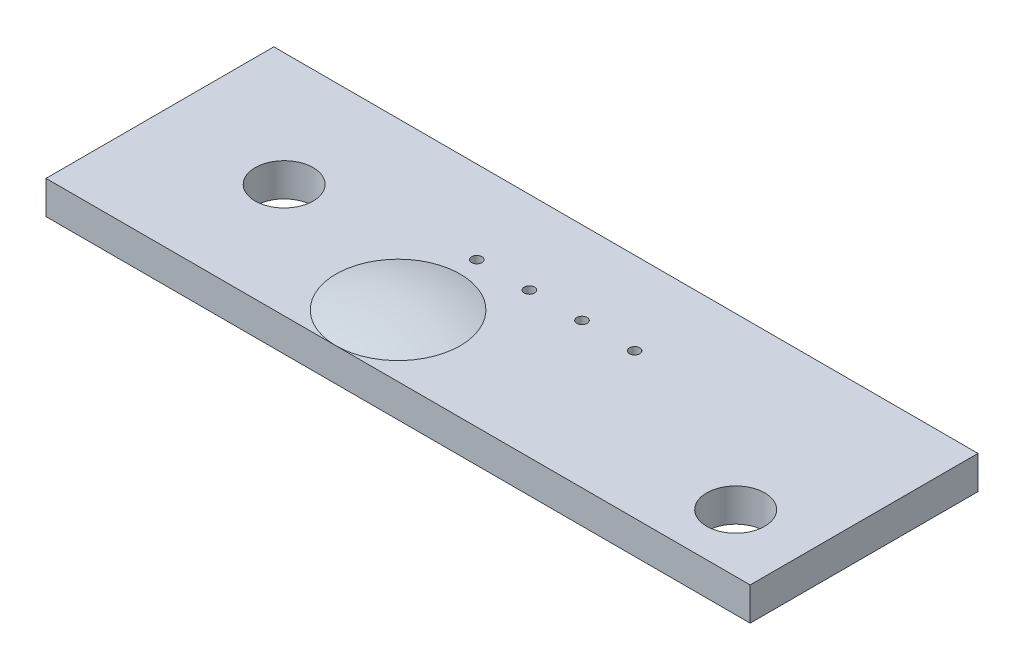
ISO-10303-21;
HEADER;
FILE_DESCRIPTION(('STEP AP214'),'2;1');
FILE_NAME('part.step','',(''),(''),'','','');
FILE_SCHEMA(('AUTOMOTIVE_DESIGN { 1 0 10303 214 1 1 1 1 }'));
ENDSEC;
DATA;
#1=APPLICATION_CONTEXT('core data for automotive mechanical design processes');
#2=APPLICATION_PROTOCOL_DEFINITION('international standard','automotive_design',2000,#1);
#3=PRODUCT_CONTEXT('',#1,'mechanical');
#4=PRODUCT('Part','Part','',(#3));
#5=PRODUCT_RELATED_PRODUCT_CATEGORY('part','',(#4));
#6=PRODUCT_DEFINITION_FORMATION('','',#4);
#7=PRODUCT_DEFINITION_CONTEXT('part definition',#1,'design');
#8=PRODUCT_DEFINITION('design','',#6,#7);
#9=PRODUCT_DEFINITION_SHAPE('','',#8);
#10=(LENGTH_UNIT() NAMED_UNIT(*) SI_UNIT(.MILLI.,.METRE.));
#11=(NAMED_UNIT(*) PLANE_ANGLE_UNIT() SI_UNIT($,.RADIAN.));
#12=(NAMED_UNIT(*) SI_UNIT($,.STERADIAN.) SOLID_ANGLE_UNIT());
#13=UNCERTAINTY_MEASURE_WITH_UNIT(LENGTH_MEASURE(1.E-05),#10,'distance_accuracy_value','');
#14=(GEOMETRIC_REPRESENTATION_CONTEXT(3) GLOBAL_UNCERTAINTY_ASSIGNED_CONTEXT((#13)) GLOBAL_UNIT_ASSIGNED_CONTEXT((#10,
#11,#12)) REPRESENTATION_CONTEXT('',''));
#15=CARTESIAN_POINT('',(0.,0.,0.));
#16=DIRECTION('',(0.,0.,1.));
#17=DIRECTION('',(1.,0.,0.));
#18=AXIS2_PLACEMENT_3D('',#15,#16,#17);
#19=CARTESIAN_POINT('',(-17.,1.6,-5.5));
#20=DIRECTION('',(0.,1.,0.));
#21=DIRECTION('',(0.,0.,1.));
#22=AXIS2_PLACEMENT_3D('',#19,#20,#21);
#23=PLANE('',#22);
#24=CARTESIAN_POINT('',(4.42,1.6,-1.50000000000006));
#25=DIRECTION('',(0.,1.,0.));
#26=DIRECTION('',(0.,0.,1.));
#27=AXIS2_PLACEMENT_3D('',#24,#25,#26);
#28=CIRCLE('',#27,0.25);
#29=CARTESIAN_POINT('',(4.42,1.6,-1.25000000000006));
#30=VERTEX_POINT('',#29);
#31=EDGE_CURVE('E139',#30,#30,#28,.T.);
#32=ORIENTED_EDGE('',*,*,#31,.F.);
#33=EDGE_LOOP('',(#32));
#34=FACE_BOUND('',#33,.T.);
#35=CARTESIAN_POINT('',(1.88,1.6,-1.50000000000004));
#36=DIRECTION('',(0.,1.,0.));
#37=DIRECTION('',(0.,0.,1.));
#38=AXIS2_PLACEMENT_3D('',#35,#36,#37);
#39=CIRCLE('',#38,0.25);
#40=CARTESIAN_POINT('',(1.88,1.6,-1.25000000000004));
#41=VERTEX_POINT('',#40);
#42=EDGE_CURVE('E129',#41,#41,#39,.T.);
#43=ORIENTED_EDGE('',*,*,#42,.F.);
#44=EDGE_LOOP('',(#43));
#45=FACE_BOUND('',#44,.T.);
#46=CARTESIAN_POINT('',(-0.66,1.6,-1.50000000000002));
#47=DIRECTION('',(0.,1.,0.));
#48=DIRECTION('',(0.,0.,1.));
#49=AXIS2_PLACEMENT_3D('',#46,#47,#48);
#50=CIRCLE('',#49,0.25);
#51=CARTESIAN_POINT('',(-0.66,1.6,-1.25000000000002));
#52=VERTEX_POINT('',#51);
#53=EDGE_CURVE('E126',#52,#52,#50,.T.);
#54=ORIENTED_EDGE('',*,*,#53,.F.);
#55=EDGE_LOOP('',(#54));
#56=FACE_BOUND('',#55,.T.);
#57=CARTESIAN_POINT('',(-3.2,1.6,-1.50000000000001));
#58=DIRECTION('',(0.,1.,0.));
#59=DIRECTION('',(0.,0.,1.));
#60=AXIS2_PLACEMENT_3D('',#57,#58,#59);
#61=CIRCLE('',#60,0.25);
#62=CARTESIAN_POINT('',(-3.2,1.6,-1.25));
#63=VERTEX_POINT('',#62);
#64=EDGE_CURVE('E123',#63,#63,#61,.T.);
#65=ORIENTED_EDGE('',*,*,#64,.F.);
#66=EDGE_LOOP('',(#65));
#67=FACE_BOUND('',#66,.T.);
#68=CARTESIAN_POINT('',(13.5,1.6,2.7));
#69=DIRECTION('',(0.,1.,0.));
#70=DIRECTION('',(0.,0.,1.));
#71=AXIS2_PLACEMENT_3D('',#68,#69,#70);
#72=CIRCLE('',#71,1.4);
#73=CARTESIAN_POINT('',(13.5,1.6,4.1));
#74=VERTEX_POINT('',#73);
#75=EDGE_CURVE('E148',#74,#74,#72,.F.);
#76=ORIENTED_EDGE('',*,*,#75,.T.);
#77=EDGE_LOOP('',(#76));
#78=FACE_BOUND('',#77,.T.);
#79=CARTESIAN_POINT('',(-11.,1.6,0.));
#80=DIRECTION('',(0.,1.,0.));
#81=DIRECTION('',(0.,0.,1.));
#82=AXIS2_PLACEMENT_3D('',#79,#80,#81);
#83=CIRCLE('',#82,1.4);
#84=CARTESIAN_POINT('',(-11.,1.6,1.4));
#85=VERTEX_POINT('',#84);
#86=EDGE_CURVE('E98',#85,#85,#83,.F.);
#87=ORIENTED_EDGE('',*,*,#86,.T.);
#88=EDGE_LOOP('',(#87));
#89=FACE_BOUND('',#88,.T.);
#90=DIRECTION('',(1.,0.,0.));
#91=VECTOR('',#90,1.);
#92=CARTESIAN_POINT('',(-17.,1.6,5.5));
#93=LINE('',#92,#91);
#94=CARTESIAN_POINT('',(-17.,1.6,5.5));
#95=VERTEX_POINT('',#94);
#96=CARTESIAN_POINT('',(-3.,1.6,5.5));
#97=VERTEX_POINT('',#96);
#98=EDGE_CURVE('E93',#95,#97,#93,.T.);
#99=ORIENTED_EDGE('',*,*,#98,.T.);
#100=CARTESIAN_POINT('',(-3.,1.6,2.5));
#101=DIRECTION('',(0.,1.,0.));
#102=DIRECTION('',(-1.,0.,0.));
#103=AXIS2_PLACEMENT_3D('',#100,#101,#102);
#104=CIRCLE('',#103,3.);
#105=EDGE_CURVE('E47',#97,#97,#104,.T.);
#106=ORIENTED_EDGE('',*,*,#105,.F.);
#107=CARTESIAN_POINT('',(17.,1.6,5.5));
#108=VERTEX_POINT('',#107);
#109=EDGE_CURVE('E110',#97,#108,#93,.T.);
#110=ORIENTED_EDGE('',*,*,#109,.T.);
#111=DIRECTION('',(0.,0.,-1.));
#112=VECTOR('',#111,1.);
#113=CARTESIAN_POINT('',(17.,1.6,-5.5));
#114=LINE('',#113,#112);
#115=CARTESIAN_POINT('',(17.,1.6,-5.5));
#116=VERTEX_POINT('',#115);
#117=EDGE_CURVE('E112',#108,#116,#114,.T.);
#118=ORIENTED_EDGE('',*,*,#117,.T.);
#119=DIRECTION('',(-1.,0.,0.));
#120=VECTOR('',#119,1.);
#121=CARTESIAN_POINT('',(-17.,1.6,-5.5));
#122=LINE('',#121,#120);
#123=CARTESIAN_POINT('',(-17.,1.6,-5.5));
#124=VERTEX_POINT('',#123);
#125=EDGE_CURVE('E54',#116,#124,#122,.T.);
#126=ORIENTED_EDGE('',*,*,#125,.T.);
#127=DIRECTION('',(0.,0.,1.));
#128=VECTOR('',#127,1.);
#129=CARTESIAN_POINT('',(-17.,1.6,-5.5));
#130=LINE('',#129,#128);
#131=EDGE_CURVE('E108',#124,#95,#130,.T.);
#132=ORIENTED_EDGE('',*,*,#131,.T.);
#133=EDGE_LOOP('',(#99,#106,#110,#118,#126,#132));
#134=FACE_BOUND('',#133,.T.);
#135=ADVANCED_FACE('F32',(#34,#45,#56,#67,#78,#89,#134),#23,.T.);
#136=CARTESIAN_POINT('',(-17.,0.,-5.5));
#137=DIRECTION('',(0.,1.,0.));
#138=DIRECTION('',(0.,0.,1.));
#139=AXIS2_PLACEMENT_3D('',#136,#137,#138);
#140=PLANE('',#139);
#141=CARTESIAN_POINT('',(4.42,0.,-1.50000000000006));
#142=DIRECTION('',(0.,1.,0.));
#143=DIRECTION('',(0.,0.,1.));
#144=AXIS2_PLACEMENT_3D('',#141,#142,#143);
#145=CIRCLE('',#144,0.25);
#146=CARTESIAN_POINT('',(4.42,0.,-1.25000000000006));
#147=VERTEX_POINT('',#146);
#148=EDGE_CURVE('E36',#147,#147,#145,.T.);
#149=ORIENTED_EDGE('',*,*,#148,.T.);
#150=EDGE_LOOP('',(#149));
#151=FACE_BOUND('',#150,.T.);
#152=CARTESIAN_POINT('',(1.88,0.,-1.50000000000004));
#153=DIRECTION('',(0.,1.,0.));
#154=DIRECTION('',(0.,0.,1.));
#155=AXIS2_PLACEMENT_3D('',#152,#153,#154);
#156=CIRCLE('',#155,0.25);
#157=CARTESIAN_POINT('',(1.88,0.,-1.25000000000004));
#158=VERTEX_POINT('',#157);
#159=EDGE_CURVE('E127',#158,#158,#156,.T.);
#160=ORIENTED_EDGE('',*,*,#159,.T.);
#161=EDGE_LOOP('',(#160));
#162=FACE_BOUND('',#161,.T.);
#163=CARTESIAN_POINT('',(-0.66,0.,-1.50000000000002));
#164=DIRECTION('',(0.,1.,0.));
#165=DIRECTION('',(0.,0.,1.));
#166=AXIS2_PLACEMENT_3D('',#163,#164,#165);
#167=CIRCLE('',#166,0.25);
#168=CARTESIAN_POINT('',(-0.66,0.,-1.25000000000002));
#169=VERTEX_POINT('',#168);
#170=EDGE_CURVE('E124',#169,#169,#167,.T.);
#171=ORIENTED_EDGE('',*,*,#170,.T.);
#172=EDGE_LOOP('',(#171));
#173=FACE_BOUND('',#172,.T.);
#174=CARTESIAN_POINT('',(-3.2,0.,-1.50000000000001));
#175=DIRECTION('',(0.,1.,0.));
#176=DIRECTION('',(0.,0.,1.));
#177=AXIS2_PLACEMENT_3D('',#174,#175,#176);
#178=CIRCLE('',#177,0.25);
#179=CARTESIAN_POINT('',(-3.2,0.,-1.25));
#180=VERTEX_POINT('',#179);
#181=EDGE_CURVE('E120',#180,#180,#178,.T.);
#182=ORIENTED_EDGE('',*,*,#181,.T.);
#183=EDGE_LOOP('',(#182));
#184=FACE_BOUND('',#183,.T.);
#185=CARTESIAN_POINT('',(-11.,0.,0.));
#186=DIRECTION('',(0.,1.,0.));
#187=DIRECTION('',(0.,0.,1.));
#188=AXIS2_PLACEMENT_3D('',#185,#186,#187);
#189=CIRCLE('',#188,1.4);
#190=CARTESIAN_POINT('',(-11.,0.,1.4));
#191=VERTEX_POINT('',#190);
#192=EDGE_CURVE('E101',#191,#191,#189,.T.);
#193=ORIENTED_EDGE('',*,*,#192,.T.);
#194=EDGE_LOOP('',(#193));
#195=FACE_BOUND('',#194,.T.);
#196=DIRECTION('',(0.,0.,1.));
#197=VECTOR('',#196,1.);
#198=CARTESIAN_POINT('',(-17.,0.,-5.5));
#199=LINE('',#198,#197);
#200=CARTESIAN_POINT('',(-17.,0.,-5.5));
#201=VERTEX_POINT('',#200);
#202=CARTESIAN_POINT('',(-17.,0.,5.5));
#203=VERTEX_POINT('',#202);
#204=EDGE_CURVE('E83',#201,#203,#199,.T.);
#205=ORIENTED_EDGE('',*,*,#204,.F.);
#206=DIRECTION('',(-1.,0.,0.));
#207=VECTOR('',#206,1.);
#208=CARTESIAN_POINT('',(-17.,0.,-5.5));
#209=LINE('',#208,#207);
#210=CARTESIAN_POINT('',(17.,0.,-5.5));
#211=VERTEX_POINT('',#210);
#212=EDGE_CURVE('E106',#211,#201,#209,.T.);
#213=ORIENTED_EDGE('',*,*,#212,.F.);
#214=DIRECTION('',(0.,0.,-1.));
#215=VECTOR('',#214,1.);
#216=CARTESIAN_POINT('',(17.,0.,-5.5));
#217=LINE('',#216,#215);
#218=CARTESIAN_POINT('',(17.,0.,5.5));
#219=VERTEX_POINT('',#218);
#220=EDGE_CURVE('E84',#219,#211,#217,.T.);
#221=ORIENTED_EDGE('',*,*,#220,.F.);
#222=DIRECTION('',(1.,0.,0.));
#223=VECTOR('',#222,1.);
#224=CARTESIAN_POINT('',(-17.,0.,5.5));
#225=LINE('',#224,#223);
#226=EDGE_CURVE('E78',#203,#219,#225,.T.);
#227=ORIENTED_EDGE('',*,*,#226,.F.);
#228=EDGE_LOOP('',(#205,#213,#221,#227));
#229=FACE_BOUND('',#228,.T.);
#230=CARTESIAN_POINT('',(13.5,0.,2.7));
#231=DIRECTION('',(0.,1.,0.));
#232=DIRECTION('',(0.,0.,1.));
#233=AXIS2_PLACEMENT_3D('',#230,#231,#232);
#234=CIRCLE('',#233,1.4);
#235=CARTESIAN_POINT('',(13.5,0.,4.1));
#236=VERTEX_POINT('',#235);
#237=EDGE_CURVE('E145',#236,#236,#234,.T.);
#238=ORIENTED_EDGE('',*,*,#237,.T.);
#239=EDGE_LOOP('',(#238));
#240=FACE_BOUND('',#239,.T.);
#241=ADVANCED_FACE('F79',(#151,#162,#173,#184,#195,#229,#240),#140,.F.);
#242=CARTESIAN_POINT('',(-17.,1.6,-5.5));
#243=DIRECTION('',(1.,0.,0.));
#244=DIRECTION('',(0.,0.,-1.));
#245=AXIS2_PLACEMENT_3D('',#242,#243,#244);
#246=PLANE('',#245);
#247=ORIENTED_EDGE('',*,*,#204,.T.);
#248=DIRECTION('',(0.,-1.,0.));
#249=VECTOR('',#248,1.);
#250=CARTESIAN_POINT('',(-17.,1.6,5.5));
#251=LINE('',#250,#249);
#252=EDGE_CURVE('E11',#95,#203,#251,.T.);
#253=ORIENTED_EDGE('',*,*,#252,.F.);
#254=ORIENTED_EDGE('',*,*,#131,.F.);
#255=DIRECTION('',(0.,-1.,0.));
#256=VECTOR('',#255,1.);
#257=CARTESIAN_POINT('',(-17.,1.6,-5.5));
#258=LINE('',#257,#256);
#259=EDGE_CURVE('E97',#124,#201,#258,.T.);
#260=ORIENTED_EDGE('',*,*,#259,.T.);
#261=EDGE_LOOP('',(#247,#253,#254,#260));
#262=FACE_BOUND('',#261,.T.);
#263=ADVANCED_FACE('F34',(#262),#246,.F.);
#264=CARTESIAN_POINT('',(-17.,1.6,5.5));
#265=DIRECTION('',(0.,0.,-1.));
#266=DIRECTION('',(-1.,0.,0.));
#267=AXIS2_PLACEMENT_3D('',#264,#265,#266);
#268=PLANE('',#267);
#269=ORIENTED_EDGE('',*,*,#226,.T.);
#270=DIRECTION('',(0.,-1.,0.));
#271=VECTOR('',#270,1.);
#272=CARTESIAN_POINT('',(17.,1.6,5.5));
#273=LINE('',#272,#271);
#274=EDGE_CURVE('E41',#108,#219,#273,.T.);
#275=ORIENTED_EDGE('',*,*,#274,.F.);
#276=ORIENTED_EDGE('',*,*,#109,.F.);
#277=ORIENTED_EDGE('',*,*,#98,.F.);
#278=ORIENTED_EDGE('',*,*,#252,.T.);
#279=EDGE_LOOP('',(#269,#275,#276,#277,#278));
#280=FACE_BOUND('',#279,.T.);
#281=ADVANCED_FACE('F90',(#280),#268,.F.);
#282=CARTESIAN_POINT('',(17.,1.6,-5.5));
#283=DIRECTION('',(-1.,0.,0.));
#284=DIRECTION('',(0.,0.,1.));
#285=AXIS2_PLACEMENT_3D('',#282,#283,#284);
#286=PLANE('',#285);
#287=ORIENTED_EDGE('',*,*,#220,.T.);
#288=DIRECTION('',(0.,-1.,0.));
#289=VECTOR('',#288,1.);
#290=CARTESIAN_POINT('',(17.,1.6,-5.5));
#291=LINE('',#290,#289);
#292=EDGE_CURVE('E116',#116,#211,#291,.T.);
#293=ORIENTED_EDGE('',*,*,#292,.F.);
#294=ORIENTED_EDGE('',*,*,#117,.F.);
#295=ORIENTED_EDGE('',*,*,#274,.T.);
#296=EDGE_LOOP('',(#287,#293,#294,#295));
#297=FACE_BOUND('',#296,.T.);
#298=ADVANCED_FACE('F167',(#297),#286,.F.);
#299=CARTESIAN_POINT('',(-17.,1.6,-5.5));
#300=DIRECTION('',(0.,0.,1.));
#301=DIRECTION('',(1.,0.,0.));
#302=AXIS2_PLACEMENT_3D('',#299,#300,#301);
#303=PLANE('',#302);
#304=ORIENTED_EDGE('',*,*,#212,.T.);
#305=ORIENTED_EDGE('',*,*,#259,.F.);
#306=ORIENTED_EDGE('',*,*,#125,.F.);
#307=ORIENTED_EDGE('',*,*,#292,.T.);
#308=EDGE_LOOP('',(#304,#305,#306,#307));
#309=FACE_BOUND('',#308,.T.);
#310=ADVANCED_FACE('F157',(#309),#303,.F.);
#311=CARTESIAN_POINT('',(-11.,6.6,0.));
#312=DIRECTION('',(0.,-1.,0.));
#313=DIRECTION('',(0.,0.,-1.));
#314=AXIS2_PLACEMENT_3D('',#311,#312,#313);
#315=CYLINDRICAL_SURFACE('',#314,1.4);
#316=ORIENTED_EDGE('',*,*,#86,.F.);
#317=EDGE_LOOP('',(#316));
#318=FACE_BOUND('',#317,.T.);
#319=ORIENTED_EDGE('',*,*,#192,.F.);
#320=EDGE_LOOP('',(#319));
#321=FACE_BOUND('',#320,.T.);
#322=ADVANCED_FACE('F154',(#318,#321),#315,.F.);
#323=CARTESIAN_POINT('',(13.5,6.6,2.7));
#324=DIRECTION('',(0.,-1.,0.));
#325=DIRECTION('',(0.,0.,-1.));
#326=AXIS2_PLACEMENT_3D('',#323,#324,#325);
#327=CYLINDRICAL_SURFACE('',#326,1.4);
#328=ORIENTED_EDGE('',*,*,#75,.F.);
#329=EDGE_LOOP('',(#328));
#330=FACE_BOUND('',#329,.T.);
#331=ORIENTED_EDGE('',*,*,#237,.F.);
#332=EDGE_LOOP('',(#331));
#333=FACE_BOUND('',#332,.T.);
#334=ADVANCED_FACE('F156',(#330,#333),#327,.F.);
#335=CARTESIAN_POINT('',(-3.,-7.93939201416946,2.5));
#336=DIRECTION('',(0.,1.,0.));
#337=DIRECTION('',(1.,0.,0.));
#338=AXIS2_PLACEMENT_3D('',#335,#336,#337);
#339=SPHERICAL_SURFACE('',#338,10.);
#340=ORIENTED_EDGE('',*,*,#105,.T.);
#341=EDGE_LOOP('',(#340));
#342=FACE_BOUND('',#341,.T.);
#343=ADVANCED_FACE('F164',(#342),#339,.T.);
#344=CARTESIAN_POINT('',(-3.2,-8.4,-1.50000000000001));
#345=DIRECTION('',(0.,1.,0.));
#346=DIRECTION('',(0.,0.,1.));
#347=AXIS2_PLACEMENT_3D('',#344,#345,#346);
#348=CYLINDRICAL_SURFACE('',#347,0.25);
#349=ORIENTED_EDGE('',*,*,#64,.T.);
#350=EDGE_LOOP('',(#349));
#351=FACE_BOUND('',#350,.T.);
#352=ORIENTED_EDGE('',*,*,#181,.F.);
#353=EDGE_LOOP('',(#352));
#354=FACE_BOUND('',#353,.T.);
#355=ADVANCED_FACE('F205',(#351,#354),#348,.F.);
#356=CARTESIAN_POINT('',(-0.66,-8.4,-1.50000000000002));
#357=DIRECTION('',(0.,1.,0.));
#358=DIRECTION('',(0.,0.,1.));
#359=AXIS2_PLACEMENT_3D('',#356,#357,#358);
#360=CYLINDRICAL_SURFACE('',#359,0.25);
#361=ORIENTED_EDGE('',*,*,#53,.T.);
#362=EDGE_LOOP('',(#361));
#363=FACE_BOUND('',#362,.T.);
#364=ORIENTED_EDGE('',*,*,#170,.F.);
#365=EDGE_LOOP('',(#364));
#366=FACE_BOUND('',#365,.T.);
#367=ADVANCED_FACE('F210',(#363,#366),#360,.F.);
#368=CARTESIAN_POINT('',(1.88,-8.4,-1.50000000000004));
#369=DIRECTION('',(0.,1.,0.));
#370=DIRECTION('',(0.,0.,1.));
#371=AXIS2_PLACEMENT_3D('',#368,#369,#370);
#372=CYLINDRICAL_SURFACE('',#371,0.25);
#373=ORIENTED_EDGE('',*,*,#42,.T.);
#374=EDGE_LOOP('',(#373));
#375=FACE_BOUND('',#374,.T.);
#376=ORIENTED_EDGE('',*,*,#159,.F.);
#377=EDGE_LOOP('',(#376));
#378=FACE_BOUND('',#377,.T.);
#379=ADVANCED_FACE('F222',(#375,#378),#372,.F.);
#380=CARTESIAN_POINT('',(4.42,-8.4,-1.50000000000006));
#381=DIRECTION('',(0.,1.,0.));
#382=DIRECTION('',(0.,0.,1.));
#383=AXIS2_PLACEMENT_3D('',#380,#381,#382);
#384=CYLINDRICAL_SURFACE('',#383,0.25);
#385=ORIENTED_EDGE('',*,*,#31,.T.);
#386=EDGE_LOOP('',(#385));
#387=FACE_BOUND('',#386,.T.);
#388=ORIENTED_EDGE('',*,*,#148,.F.);
#389=EDGE_LOOP('',(#388));
#390=FACE_BOUND('',#389,.T.);
#391=ADVANCED_FACE('F232',(#387,#390),#384,.F.);
#392=CLOSED_SHELL('',(#135,#241,#263,#281,#298,#310,#322,#334,#343,#355,#367,#379,#391));
#393=MANIFOLD_SOLID_BREP('B2',#392);
#394=ADVANCED_BREP_SHAPE_REPRESENTATION('',(#18,#393),#14);
#395=SHAPE_DEFINITION_REPRESENTATION(#9,#394);
ENDSEC;
END-ISO-10303-21;
